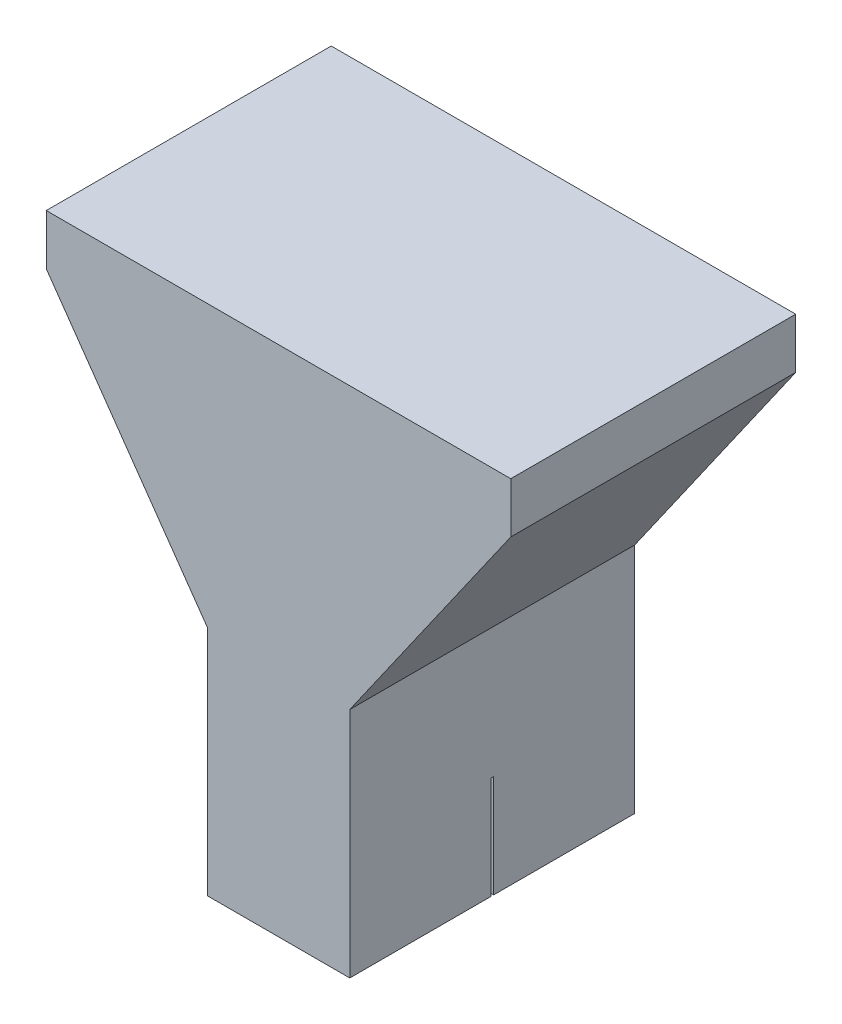
ISO-10303-21;
HEADER;
FILE_DESCRIPTION(('STEP AP214'),'2;1');
FILE_NAME('part.step','',(''),(''),'','','');
FILE_SCHEMA(('AUTOMOTIVE_DESIGN { 1 0 10303 214 1 1 1 1 }'));
ENDSEC;
DATA;
#1=APPLICATION_CONTEXT('core data for automotive mechanical design processes');
#2=APPLICATION_PROTOCOL_DEFINITION('international standard','automotive_design',2000,#1);
#3=PRODUCT_CONTEXT('',#1,'mechanical');
#4=PRODUCT('Part','Part','',(#3));
#5=PRODUCT_RELATED_PRODUCT_CATEGORY('part','',(#4));
#6=PRODUCT_DEFINITION_FORMATION('','',#4);
#7=PRODUCT_DEFINITION_CONTEXT('part definition',#1,'design');
#8=PRODUCT_DEFINITION('design','',#6,#7);
#9=PRODUCT_DEFINITION_SHAPE('','',#8);
#10=(LENGTH_UNIT() NAMED_UNIT(*) SI_UNIT(.MILLI.,.METRE.));
#11=(NAMED_UNIT(*) PLANE_ANGLE_UNIT() SI_UNIT($,.RADIAN.));
#12=(NAMED_UNIT(*) SI_UNIT($,.STERADIAN.) SOLID_ANGLE_UNIT());
#13=UNCERTAINTY_MEASURE_WITH_UNIT(LENGTH_MEASURE(1.E-05),#10,'distance_accuracy_value','');
#14=(GEOMETRIC_REPRESENTATION_CONTEXT(3) GLOBAL_UNCERTAINTY_ASSIGNED_CONTEXT((#13)) GLOBAL_UNIT_ASSIGNED_CONTEXT((#10,
#11,#12)) REPRESENTATION_CONTEXT('',''));
#15=CARTESIAN_POINT('',(0.,0.,0.));
#16=DIRECTION('',(0.,0.,1.));
#17=DIRECTION('',(1.,0.,0.));
#18=AXIS2_PLACEMENT_3D('',#15,#16,#17);
#19=CARTESIAN_POINT('',(0.,0.,500.));
#20=DIRECTION('',(0.,1.,0.));
#21=DIRECTION('',(0.,0.,1.));
#22=AXIS2_PLACEMENT_3D('',#19,#20,#21);
#23=PLANE('',#22);
#24=CARTESIAN_POINT('',(0.,0.,375.));
#25=DIRECTION('',(0.,-1.,0.));
#26=DIRECTION('',(0.,0.,-1.));
#27=AXIS2_PLACEMENT_3D('',#24,#25,#26);
#28=CIRCLE('',#27,15.);
#29=CARTESIAN_POINT('',(0.,0.,360.));
#30=VERTEX_POINT('',#29);
#31=EDGE_CURVE('E162',#30,#30,#28,.T.);
#32=ORIENTED_EDGE('',*,*,#31,.F.);
#33=EDGE_LOOP('',(#32));
#34=FACE_BOUND('',#33,.T.);
#35=DIRECTION('',(-1.,0.,0.));
#36=VECTOR('',#35,1.);
#37=CARTESIAN_POINT('',(125.,0.,252.5));
#38=LINE('',#37,#36);
#39=CARTESIAN_POINT('',(125.,0.,252.5));
#40=VERTEX_POINT('',#39);
#41=CARTESIAN_POINT('',(-125.,0.,252.5));
#42=VERTEX_POINT('',#41);
#43=EDGE_CURVE('E48',#40,#42,#38,.T.);
#44=ORIENTED_EDGE('',*,*,#43,.F.);
#45=DIRECTION('',(0.,0.,-1.));
#46=VECTOR('',#45,1.);
#47=CARTESIAN_POINT('',(125.,0.,500.));
#48=LINE('',#47,#46);
#49=CARTESIAN_POINT('',(125.,0.,500.));
#50=VERTEX_POINT('',#49);
#51=EDGE_CURVE('E11',#50,#40,#48,.T.);
#52=ORIENTED_EDGE('',*,*,#51,.F.);
#53=DIRECTION('',(1.,0.,0.));
#54=VECTOR('',#53,1.);
#55=CARTESIAN_POINT('',(0.,0.,500.));
#56=LINE('',#55,#54);
#57=CARTESIAN_POINT('',(-125.,0.,500.));
#58=VERTEX_POINT('',#57);
#59=EDGE_CURVE('E213',#58,#50,#56,.T.);
#60=ORIENTED_EDGE('',*,*,#59,.F.);
#61=DIRECTION('',(0.,0.,-1.));
#62=VECTOR('',#61,1.);
#63=CARTESIAN_POINT('',(-125.,0.,500.));
#64=LINE('',#63,#62);
#65=EDGE_CURVE('E140',#58,#42,#64,.T.);
#66=ORIENTED_EDGE('',*,*,#65,.T.);
#67=EDGE_LOOP('',(#44,#52,#60,#66));
#68=FACE_BOUND('',#67,.T.);
#69=ADVANCED_FACE('F33',(#34,#68),#23,.F.);
#70=CARTESIAN_POINT('',(0.,0.,125.));
#71=DIRECTION('',(0.,-1.,0.));
#72=DIRECTION('',(0.,0.,-1.));
#73=AXIS2_PLACEMENT_3D('',#70,#71,#72);
#74=CIRCLE('',#73,15.);
#75=CARTESIAN_POINT('',(0.,0.,110.));
#76=VERTEX_POINT('',#75);
#77=EDGE_CURVE('E203',#76,#76,#74,.T.);
#78=ORIENTED_EDGE('',*,*,#77,.F.);
#79=EDGE_LOOP('',(#78));
#80=FACE_BOUND('',#79,.T.);
#81=CARTESIAN_POINT('',(125.,0.,247.5));
#82=VERTEX_POINT('',#81);
#83=CARTESIAN_POINT('',(125.,0.,0.));
#84=VERTEX_POINT('',#83);
#85=EDGE_CURVE('E41',#82,#84,#48,.T.);
#86=ORIENTED_EDGE('',*,*,#85,.F.);
#87=DIRECTION('',(-1.,0.,0.));
#88=VECTOR('',#87,1.);
#89=CARTESIAN_POINT('',(125.,0.,247.5));
#90=LINE('',#89,#88);
#91=CARTESIAN_POINT('',(-125.,0.,247.5));
#92=VERTEX_POINT('',#91);
#93=EDGE_CURVE('E248',#82,#92,#90,.T.);
#94=ORIENTED_EDGE('',*,*,#93,.T.);
#95=CARTESIAN_POINT('',(-125.,0.,0.));
#96=VERTEX_POINT('',#95);
#97=EDGE_CURVE('E187',#92,#96,#64,.T.);
#98=ORIENTED_EDGE('',*,*,#97,.T.);
#99=DIRECTION('',(1.,0.,0.));
#100=VECTOR('',#99,1.);
#101=CARTESIAN_POINT('',(0.,0.,0.));
#102=LINE('',#101,#100);
#103=EDGE_CURVE('E212',#96,#84,#102,.T.);
#104=ORIENTED_EDGE('',*,*,#103,.T.);
#105=EDGE_LOOP('',(#86,#94,#98,#104));
#106=FACE_BOUND('',#105,.T.);
#107=ADVANCED_FACE('F35',(#80,#106),#23,.F.);
#108=CARTESIAN_POINT('',(125.,0.,500.));
#109=DIRECTION('',(-1.,0.,0.));
#110=DIRECTION('',(0.,0.,1.));
#111=AXIS2_PLACEMENT_3D('',#108,#109,#110);
#112=PLANE('',#111);
#113=DIRECTION('',(0.,0.,1.));
#114=VECTOR('',#113,1.);
#115=CARTESIAN_POINT('',(125.,180.,247.5));
#116=LINE('',#115,#114);
#117=CARTESIAN_POINT('',(125.,180.,247.5));
#118=VERTEX_POINT('',#117);
#119=CARTESIAN_POINT('',(125.,180.,252.5));
#120=VERTEX_POINT('',#119);
#121=EDGE_CURVE('E145',#118,#120,#116,.T.);
#122=ORIENTED_EDGE('',*,*,#121,.F.);
#123=DIRECTION('',(0.,-1.,0.));
#124=VECTOR('',#123,1.);
#125=CARTESIAN_POINT('',(125.,180.,247.5));
#126=LINE('',#125,#124);
#127=EDGE_CURVE('E240',#118,#82,#126,.T.);
#128=ORIENTED_EDGE('',*,*,#127,.T.);
#129=ORIENTED_EDGE('',*,*,#85,.T.);
#130=DIRECTION('',(0.,1.,0.));
#131=VECTOR('',#130,1.);
#132=CARTESIAN_POINT('',(125.,0.,0.));
#133=LINE('',#132,#131);
#134=CARTESIAN_POINT('',(125.,408.,0.));
#135=VERTEX_POINT('',#134);
#136=EDGE_CURVE('E225',#84,#135,#133,.T.);
#137=ORIENTED_EDGE('',*,*,#136,.T.);
#138=DIRECTION('',(0.,0.,-1.));
#139=VECTOR('',#138,1.);
#140=CARTESIAN_POINT('',(125.,408.,500.));
#141=LINE('',#140,#139);
#142=CARTESIAN_POINT('',(125.,408.,500.));
#143=VERTEX_POINT('',#142);
#144=EDGE_CURVE('E233',#143,#135,#141,.T.);
#145=ORIENTED_EDGE('',*,*,#144,.F.);
#146=DIRECTION('',(0.,1.,0.));
#147=VECTOR('',#146,1.);
#148=CARTESIAN_POINT('',(125.,0.,500.));
#149=LINE('',#148,#147);
#150=EDGE_CURVE('E85',#50,#143,#149,.T.);
#151=ORIENTED_EDGE('',*,*,#150,.F.);
#152=ORIENTED_EDGE('',*,*,#51,.T.);
#153=DIRECTION('',(0.,-1.,0.));
#154=VECTOR('',#153,1.);
#155=CARTESIAN_POINT('',(125.,180.,252.5));
#156=LINE('',#155,#154);
#157=EDGE_CURVE('E130',#120,#40,#156,.T.);
#158=ORIENTED_EDGE('',*,*,#157,.F.);
#159=EDGE_LOOP('',(#122,#128,#129,#137,#145,#151,#152,#158));
#160=FACE_BOUND('',#159,.T.);
#161=ADVANCED_FACE('F143',(#160),#112,.F.);
#162=CARTESIAN_POINT('',(125.,408.,500.));
#163=DIRECTION('',(-0.819152044288993,0.573576436351044,0.));
#164=DIRECTION('',(-0.573576436351044,-0.819152044288993,0.));
#165=AXIS2_PLACEMENT_3D('',#162,#163,#164);
#166=PLANE('',#165);
#167=DIRECTION('',(0.573576436351044,0.819152044288993,0.));
#168=VECTOR('',#167,1.);
#169=CARTESIAN_POINT('',(125.,408.,0.));
#170=LINE('',#169,#168);
#171=CARTESIAN_POINT('',(407.5,811.45181190465,0.));
#172=VERTEX_POINT('',#171);
#173=EDGE_CURVE('E227',#135,#172,#170,.T.);
#174=ORIENTED_EDGE('',*,*,#173,.T.);
#175=DIRECTION('',(0.,0.,-1.));
#176=VECTOR('',#175,1.);
#177=CARTESIAN_POINT('',(407.5,811.45181190465,500.));
#178=LINE('',#177,#176);
#179=CARTESIAN_POINT('',(407.5,811.45181190465,500.));
#180=VERTEX_POINT('',#179);
#181=EDGE_CURVE('E232',#180,#172,#178,.T.);
#182=ORIENTED_EDGE('',*,*,#181,.F.);
#183=DIRECTION('',(0.573576436351044,0.819152044288993,0.));
#184=VECTOR('',#183,1.);
#185=CARTESIAN_POINT('',(125.,408.,500.));
#186=LINE('',#185,#184);
#187=EDGE_CURVE('E217',#143,#180,#186,.T.);
#188=ORIENTED_EDGE('',*,*,#187,.F.);
#189=ORIENTED_EDGE('',*,*,#144,.T.);
#190=EDGE_LOOP('',(#174,#182,#188,#189));
#191=FACE_BOUND('',#190,.T.);
#192=ADVANCED_FACE('F147',(#191),#166,.F.);
#193=CARTESIAN_POINT('',(407.5,811.45181190465,500.));
#194=DIRECTION('',(-1.,0.,0.));
#195=DIRECTION('',(0.,0.,1.));
#196=AXIS2_PLACEMENT_3D('',#193,#194,#195);
#197=PLANE('',#196);
#198=DIRECTION('',(0.,1.,0.));
#199=VECTOR('',#198,1.);
#200=CARTESIAN_POINT('',(407.5,811.45181190465,0.));
#201=LINE('',#200,#199);
#202=CARTESIAN_POINT('',(407.5,900.,0.));
#203=VERTEX_POINT('',#202);
#204=EDGE_CURVE('E78',#172,#203,#201,.T.);
#205=ORIENTED_EDGE('',*,*,#204,.T.);
#206=DIRECTION('',(0.,0.,-1.));
#207=VECTOR('',#206,1.);
#208=CARTESIAN_POINT('',(407.5,900.,500.));
#209=LINE('',#208,#207);
#210=CARTESIAN_POINT('',(407.5,900.,500.));
#211=VERTEX_POINT('',#210);
#212=EDGE_CURVE('E222',#211,#203,#209,.T.);
#213=ORIENTED_EDGE('',*,*,#212,.F.);
#214=DIRECTION('',(0.,1.,0.));
#215=VECTOR('',#214,1.);
#216=CARTESIAN_POINT('',(407.5,811.45181190465,500.));
#217=LINE('',#216,#215);
#218=EDGE_CURVE('E57',#180,#211,#217,.T.);
#219=ORIENTED_EDGE('',*,*,#218,.F.);
#220=ORIENTED_EDGE('',*,*,#181,.T.);
#221=EDGE_LOOP('',(#205,#213,#219,#220));
#222=FACE_BOUND('',#221,.T.);
#223=ADVANCED_FACE('F152',(#222),#197,.F.);
#224=CARTESIAN_POINT('',(407.5,900.,500.));
#225=DIRECTION('',(0.,-1.,0.));
#226=DIRECTION('',(1.,0.,0.));
#227=AXIS2_PLACEMENT_3D('',#224,#225,#226);
#228=PLANE('',#227);
#229=DIRECTION('',(-1.,0.,0.));
#230=VECTOR('',#229,1.);
#231=CARTESIAN_POINT('',(407.5,900.,0.));
#232=LINE('',#231,#230);
#233=CARTESIAN_POINT('',(-407.5,900.,0.));
#234=VERTEX_POINT('',#233);
#235=EDGE_CURVE('E215',#203,#234,#232,.T.);
#236=ORIENTED_EDGE('',*,*,#235,.T.);
#237=DIRECTION('',(0.,0.,-1.));
#238=VECTOR('',#237,1.);
#239=CARTESIAN_POINT('',(-407.5,900.,500.));
#240=LINE('',#239,#238);
#241=CARTESIAN_POINT('',(-407.5,900.,500.));
#242=VERTEX_POINT('',#241);
#243=EDGE_CURVE('E200',#242,#234,#240,.T.);
#244=ORIENTED_EDGE('',*,*,#243,.F.);
#245=DIRECTION('',(-1.,0.,0.));
#246=VECTOR('',#245,1.);
#247=CARTESIAN_POINT('',(407.5,900.,500.));
#248=LINE('',#247,#246);
#249=EDGE_CURVE('E220',#211,#242,#248,.T.);
#250=ORIENTED_EDGE('',*,*,#249,.F.);
#251=ORIENTED_EDGE('',*,*,#212,.T.);
#252=EDGE_LOOP('',(#236,#244,#250,#251));
#253=FACE_BOUND('',#252,.T.);
#254=ADVANCED_FACE('F265',(#253),#228,.F.);
#255=CARTESIAN_POINT('',(0.,0.,500.));
#256=DIRECTION('',(0.,0.,1.));
#257=DIRECTION('',(1.,0.,0.));
#258=AXIS2_PLACEMENT_3D('',#255,#256,#257);
#259=PLANE('',#258);
#260=ORIENTED_EDGE('',*,*,#59,.T.);
#261=ORIENTED_EDGE('',*,*,#150,.T.);
#262=ORIENTED_EDGE('',*,*,#187,.T.);
#263=ORIENTED_EDGE('',*,*,#218,.T.);
#264=ORIENTED_EDGE('',*,*,#249,.T.);
#265=DIRECTION('',(0.,1.,0.));
#266=VECTOR('',#265,1.);
#267=CARTESIAN_POINT('',(-407.5,811.45181190465,500.));
#268=LINE('',#267,#266);
#269=CARTESIAN_POINT('',(-407.5,811.45181190465,500.));
#270=VERTEX_POINT('',#269);
#271=EDGE_CURVE('E177',#270,#242,#268,.T.);
#272=ORIENTED_EDGE('',*,*,#271,.F.);
#273=DIRECTION('',(-0.573576436351044,0.819152044288993,0.));
#274=VECTOR('',#273,1.);
#275=CARTESIAN_POINT('',(-125.,408.,500.));
#276=LINE('',#275,#274);
#277=CARTESIAN_POINT('',(-125.,408.,500.));
#278=VERTEX_POINT('',#277);
#279=EDGE_CURVE('E180',#278,#270,#276,.T.);
#280=ORIENTED_EDGE('',*,*,#279,.F.);
#281=DIRECTION('',(0.,1.,0.));
#282=VECTOR('',#281,1.);
#283=CARTESIAN_POINT('',(-125.,0.,500.));
#284=LINE('',#283,#282);
#285=EDGE_CURVE('E184',#58,#278,#284,.T.);
#286=ORIENTED_EDGE('',*,*,#285,.F.);
#287=EDGE_LOOP('',(#260,#261,#262,#263,#264,#272,#280,#286));
#288=FACE_BOUND('',#287,.T.);
#289=ADVANCED_FACE('F267',(#288),#259,.T.);
#290=CARTESIAN_POINT('',(0.,0.,0.));
#291=DIRECTION('',(0.,0.,1.));
#292=DIRECTION('',(1.,0.,0.));
#293=AXIS2_PLACEMENT_3D('',#290,#291,#292);
#294=PLANE('',#293);
#295=ORIENTED_EDGE('',*,*,#103,.F.);
#296=DIRECTION('',(0.,1.,0.));
#297=VECTOR('',#296,1.);
#298=CARTESIAN_POINT('',(-125.,0.,0.));
#299=LINE('',#298,#297);
#300=CARTESIAN_POINT('',(-125.,408.,0.));
#301=VERTEX_POINT('',#300);
#302=EDGE_CURVE('E181',#96,#301,#299,.T.);
#303=ORIENTED_EDGE('',*,*,#302,.T.);
#304=DIRECTION('',(-0.573576436351044,0.819152044288993,0.));
#305=VECTOR('',#304,1.);
#306=CARTESIAN_POINT('',(-125.,408.,0.));
#307=LINE('',#306,#305);
#308=CARTESIAN_POINT('',(-407.5,811.45181190465,0.));
#309=VERTEX_POINT('',#308);
#310=EDGE_CURVE('E190',#301,#309,#307,.T.);
#311=ORIENTED_EDGE('',*,*,#310,.T.);
#312=DIRECTION('',(0.,1.,0.));
#313=VECTOR('',#312,1.);
#314=CARTESIAN_POINT('',(-407.5,811.45181190465,0.));
#315=LINE('',#314,#313);
#316=EDGE_CURVE('E176',#309,#234,#315,.T.);
#317=ORIENTED_EDGE('',*,*,#316,.T.);
#318=ORIENTED_EDGE('',*,*,#235,.F.);
#319=ORIENTED_EDGE('',*,*,#204,.F.);
#320=ORIENTED_EDGE('',*,*,#173,.F.);
#321=ORIENTED_EDGE('',*,*,#136,.F.);
#322=EDGE_LOOP('',(#295,#303,#311,#317,#318,#319,#320,#321));
#323=FACE_BOUND('',#322,.T.);
#324=ADVANCED_FACE('F245',(#323),#294,.F.);
#325=CARTESIAN_POINT('',(0.,30.,125.));
#326=DIRECTION('',(0.,1.,0.));
#327=DIRECTION('',(0.,0.,1.));
#328=AXIS2_PLACEMENT_3D('',#325,#326,#327);
#329=PLANE('',#328);
#330=CARTESIAN_POINT('',(0.,30.,125.));
#331=DIRECTION('',(0.,-1.,0.));
#332=DIRECTION('',(0.,0.,-1.));
#333=AXIS2_PLACEMENT_3D('',#330,#331,#332);
#334=CIRCLE('',#333,10.);
#335=CARTESIAN_POINT('',(0.,30.,115.));
#336=VERTEX_POINT('',#335);
#337=EDGE_CURVE('E209',#336,#336,#334,.T.);
#338=ORIENTED_EDGE('',*,*,#337,.T.);
#339=EDGE_LOOP('',(#338));
#340=FACE_BOUND('',#339,.T.);
#341=ADVANCED_FACE('F315',(#340),#329,.F.);
#342=CARTESIAN_POINT('',(0.,20.,125.));
#343=DIRECTION('',(0.,-1.,0.));
#344=DIRECTION('',(0.,0.,-1.));
#345=AXIS2_PLACEMENT_3D('',#342,#343,#344);
#346=CONICAL_SURFACE('',#345,15.,0.463647609000807);
#347=CARTESIAN_POINT('',(0.,20.,125.));
#348=DIRECTION('',(0.,-1.,0.));
#349=DIRECTION('',(0.,0.,-1.));
#350=AXIS2_PLACEMENT_3D('',#347,#348,#349);
#351=CIRCLE('',#350,15.);
#352=CARTESIAN_POINT('',(0.,20.,110.));
#353=VERTEX_POINT('',#352);
#354=EDGE_CURVE('E206',#353,#353,#351,.T.);
#355=ORIENTED_EDGE('',*,*,#354,.T.);
#356=EDGE_LOOP('',(#355));
#357=FACE_BOUND('',#356,.T.);
#358=ORIENTED_EDGE('',*,*,#337,.F.);
#359=EDGE_LOOP('',(#358));
#360=FACE_BOUND('',#359,.T.);
#361=ADVANCED_FACE('F311',(#357,#360),#346,.F.);
#362=CARTESIAN_POINT('',(0.,0.,125.));
#363=DIRECTION('',(0.,-1.,0.));
#364=DIRECTION('',(0.,0.,-1.));
#365=AXIS2_PLACEMENT_3D('',#362,#363,#364);
#366=CYLINDRICAL_SURFACE('',#365,15.);
#367=ORIENTED_EDGE('',*,*,#77,.T.);
#368=EDGE_LOOP('',(#367));
#369=FACE_BOUND('',#368,.T.);
#370=ORIENTED_EDGE('',*,*,#354,.F.);
#371=EDGE_LOOP('',(#370));
#372=FACE_BOUND('',#371,.T.);
#373=ADVANCED_FACE('F308',(#369,#372),#366,.F.);
#374=CARTESIAN_POINT('',(-407.5,811.45181190465,500.));
#375=DIRECTION('',(-1.,0.,0.));
#376=DIRECTION('',(0.,0.,1.));
#377=AXIS2_PLACEMENT_3D('',#374,#375,#376);
#378=PLANE('',#377);
#379=ORIENTED_EDGE('',*,*,#316,.F.);
#380=DIRECTION('',(0.,0.,-1.));
#381=VECTOR('',#380,1.);
#382=CARTESIAN_POINT('',(-407.5,811.45181190465,500.));
#383=LINE('',#382,#381);
#384=EDGE_CURVE('E198',#270,#309,#383,.T.);
#385=ORIENTED_EDGE('',*,*,#384,.F.);
#386=ORIENTED_EDGE('',*,*,#271,.T.);
#387=ORIENTED_EDGE('',*,*,#243,.T.);
#388=EDGE_LOOP('',(#379,#385,#386,#387));
#389=FACE_BOUND('',#388,.T.);
#390=ADVANCED_FACE('F261',(#389),#378,.T.);
#391=CARTESIAN_POINT('',(-125.,408.,500.));
#392=DIRECTION('',(-0.819152044288993,-0.573576436351044,0.));
#393=DIRECTION('',(0.573576436351044,-0.819152044288993,0.));
#394=AXIS2_PLACEMENT_3D('',#391,#392,#393);
#395=PLANE('',#394);
#396=ORIENTED_EDGE('',*,*,#310,.F.);
#397=DIRECTION('',(0.,0.,-1.));
#398=VECTOR('',#397,1.);
#399=CARTESIAN_POINT('',(-125.,408.,500.));
#400=LINE('',#399,#398);
#401=EDGE_CURVE('E196',#278,#301,#400,.T.);
#402=ORIENTED_EDGE('',*,*,#401,.F.);
#403=ORIENTED_EDGE('',*,*,#279,.T.);
#404=ORIENTED_EDGE('',*,*,#384,.T.);
#405=EDGE_LOOP('',(#396,#402,#403,#404));
#406=FACE_BOUND('',#405,.T.);
#407=ADVANCED_FACE('F257',(#406),#395,.T.);
#408=CARTESIAN_POINT('',(-125.,0.,500.));
#409=DIRECTION('',(-1.,0.,0.));
#410=DIRECTION('',(0.,0.,1.));
#411=AXIS2_PLACEMENT_3D('',#408,#409,#410);
#412=PLANE('',#411);
#413=DIRECTION('',(0.,1.,0.));
#414=VECTOR('',#413,1.);
#415=CARTESIAN_POINT('',(-125.,180.,247.5));
#416=LINE('',#415,#414);
#417=CARTESIAN_POINT('',(-125.,180.,247.5));
#418=VERTEX_POINT('',#417);
#419=EDGE_CURVE('E252',#92,#418,#416,.T.);
#420=ORIENTED_EDGE('',*,*,#419,.T.);
#421=DIRECTION('',(0.,0.,1.));
#422=VECTOR('',#421,1.);
#423=CARTESIAN_POINT('',(-125.,180.,247.5));
#424=LINE('',#423,#422);
#425=CARTESIAN_POINT('',(-125.,180.,252.5));
#426=VERTEX_POINT('',#425);
#427=EDGE_CURVE('E165',#418,#426,#424,.T.);
#428=ORIENTED_EDGE('',*,*,#427,.T.);
#429=DIRECTION('',(0.,1.,0.));
#430=VECTOR('',#429,1.);
#431=CARTESIAN_POINT('',(-125.,180.,252.5));
#432=LINE('',#431,#430);
#433=EDGE_CURVE('E141',#42,#426,#432,.T.);
#434=ORIENTED_EDGE('',*,*,#433,.F.);
#435=ORIENTED_EDGE('',*,*,#65,.F.);
#436=ORIENTED_EDGE('',*,*,#285,.T.);
#437=ORIENTED_EDGE('',*,*,#401,.T.);
#438=ORIENTED_EDGE('',*,*,#302,.F.);
#439=ORIENTED_EDGE('',*,*,#97,.F.);
#440=EDGE_LOOP('',(#420,#428,#434,#435,#436,#437,#438,#439));
#441=FACE_BOUND('',#440,.T.);
#442=ADVANCED_FACE('F251',(#441),#412,.T.);
#443=CARTESIAN_POINT('',(0.,30.,375.));
#444=DIRECTION('',(0.,1.,0.));
#445=DIRECTION('',(0.,0.,1.));
#446=AXIS2_PLACEMENT_3D('',#443,#444,#445);
#447=PLANE('',#446);
#448=CARTESIAN_POINT('',(0.,30.,375.));
#449=DIRECTION('',(0.,-1.,0.));
#450=DIRECTION('',(0.,0.,-1.));
#451=AXIS2_PLACEMENT_3D('',#448,#449,#450);
#452=CIRCLE('',#451,10.);
#453=CARTESIAN_POINT('',(0.,30.,365.));
#454=VERTEX_POINT('',#453);
#455=EDGE_CURVE('E168',#454,#454,#452,.T.);
#456=ORIENTED_EDGE('',*,*,#455,.T.);
#457=EDGE_LOOP('',(#456));
#458=FACE_BOUND('',#457,.T.);
#459=ADVANCED_FACE('F297',(#458),#447,.F.);
#460=CARTESIAN_POINT('',(0.,20.,375.));
#461=DIRECTION('',(0.,-1.,0.));
#462=DIRECTION('',(0.,0.,-1.));
#463=AXIS2_PLACEMENT_3D('',#460,#461,#462);
#464=CONICAL_SURFACE('',#463,15.,0.463647609000807);
#465=ORIENTED_EDGE('',*,*,#455,.F.);
#466=EDGE_LOOP('',(#465));
#467=FACE_BOUND('',#466,.T.);
#468=CARTESIAN_POINT('',(0.,20.,375.));
#469=DIRECTION('',(0.,-1.,0.));
#470=DIRECTION('',(0.,0.,-1.));
#471=AXIS2_PLACEMENT_3D('',#468,#469,#470);
#472=CIRCLE('',#471,15.);
#473=CARTESIAN_POINT('',(0.,20.,360.));
#474=VERTEX_POINT('',#473);
#475=EDGE_CURVE('E164',#474,#474,#472,.T.);
#476=ORIENTED_EDGE('',*,*,#475,.T.);
#477=EDGE_LOOP('',(#476));
#478=FACE_BOUND('',#477,.T.);
#479=ADVANCED_FACE('F293',(#467,#478),#464,.F.);
#480=CARTESIAN_POINT('',(0.,0.,375.));
#481=DIRECTION('',(0.,-1.,0.));
#482=DIRECTION('',(0.,0.,-1.));
#483=AXIS2_PLACEMENT_3D('',#480,#481,#482);
#484=CYLINDRICAL_SURFACE('',#483,15.);
#485=ORIENTED_EDGE('',*,*,#475,.F.);
#486=EDGE_LOOP('',(#485));
#487=FACE_BOUND('',#486,.T.);
#488=ORIENTED_EDGE('',*,*,#31,.T.);
#489=EDGE_LOOP('',(#488));
#490=FACE_BOUND('',#489,.T.);
#491=ADVANCED_FACE('F288',(#487,#490),#484,.F.);
#492=CARTESIAN_POINT('',(125.,180.,247.5));
#493=DIRECTION('',(0.,-1.,0.));
#494=DIRECTION('',(0.,0.,-1.));
#495=AXIS2_PLACEMENT_3D('',#492,#493,#494);
#496=PLANE('',#495);
#497=ORIENTED_EDGE('',*,*,#427,.F.);
#498=DIRECTION('',(1.,0.,0.));
#499=VECTOR('',#498,1.);
#500=CARTESIAN_POINT('',(125.,180.,247.5));
#501=LINE('',#500,#499);
#502=EDGE_CURVE('E275',#418,#118,#501,.T.);
#503=ORIENTED_EDGE('',*,*,#502,.T.);
#504=ORIENTED_EDGE('',*,*,#121,.T.);
#505=DIRECTION('',(1.,0.,0.));
#506=VECTOR('',#505,1.);
#507=CARTESIAN_POINT('',(125.,180.,252.5));
#508=LINE('',#507,#506);
#509=EDGE_CURVE('E133',#426,#120,#508,.T.);
#510=ORIENTED_EDGE('',*,*,#509,.F.);
#511=EDGE_LOOP('',(#497,#503,#504,#510));
#512=FACE_BOUND('',#511,.T.);
#513=ADVANCED_FACE('F277',(#512),#496,.T.);
#514=CARTESIAN_POINT('',(0.,0.,247.5));
#515=DIRECTION('',(0.,0.,-1.));
#516=DIRECTION('',(-1.,0.,0.));
#517=AXIS2_PLACEMENT_3D('',#514,#515,#516);
#518=PLANE('',#517);
#519=ORIENTED_EDGE('',*,*,#127,.F.);
#520=ORIENTED_EDGE('',*,*,#502,.F.);
#521=ORIENTED_EDGE('',*,*,#419,.F.);
#522=ORIENTED_EDGE('',*,*,#93,.F.);
#523=EDGE_LOOP('',(#519,#520,#521,#522));
#524=FACE_BOUND('',#523,.T.);
#525=ADVANCED_FACE('F280',(#524),#518,.F.);
#526=CARTESIAN_POINT('',(0.,0.,252.5));
#527=DIRECTION('',(0.,0.,-1.));
#528=DIRECTION('',(-1.,0.,0.));
#529=AXIS2_PLACEMENT_3D('',#526,#527,#528);
#530=PLANE('',#529);
#531=ORIENTED_EDGE('',*,*,#157,.T.);
#532=ORIENTED_EDGE('',*,*,#43,.T.);
#533=ORIENTED_EDGE('',*,*,#433,.T.);
#534=ORIENTED_EDGE('',*,*,#509,.T.);
#535=EDGE_LOOP('',(#531,#532,#533,#534));
#536=FACE_BOUND('',#535,.T.);
#537=ADVANCED_FACE('F131',(#536),#530,.T.);
#538=CLOSED_SHELL('',(#69,#107,#161,#192,#223,#254,#289,#324,#341,#361,#373,#390,#407,#442,#459,
#479,#491,#513,#525,#537));
#539=MANIFOLD_SOLID_BREP('B2',#538);
#540=ADVANCED_BREP_SHAPE_REPRESENTATION('',(#18,#539),#14);
#541=SHAPE_DEFINITION_REPRESENTATION(#9,#540);
ENDSEC;
END-ISO-10303-21;
